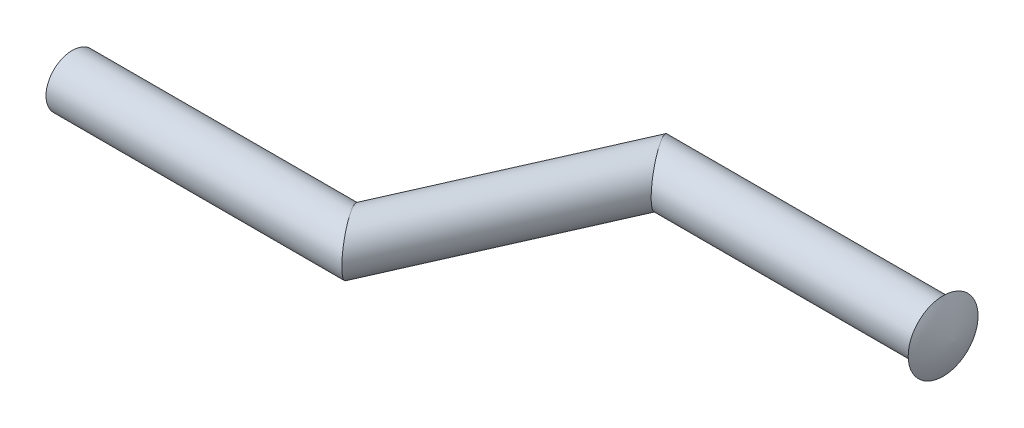
ISO-10303-21;
HEADER;
FILE_DESCRIPTION(('STEP AP214'),'2;1');
FILE_NAME('part.step','',(''),(''),'','','');
FILE_SCHEMA(('AUTOMOTIVE_DESIGN { 1 0 10303 214 1 1 1 1 }'));
ENDSEC;
DATA;
#1=APPLICATION_CONTEXT('core data for automotive mechanical design processes');
#2=APPLICATION_PROTOCOL_DEFINITION('international standard','automotive_design',2000,#1);
#3=PRODUCT_CONTEXT('',#1,'mechanical');
#4=PRODUCT('Part','Part','',(#3));
#5=PRODUCT_RELATED_PRODUCT_CATEGORY('part','',(#4));
#6=PRODUCT_DEFINITION_FORMATION('','',#4);
#7=PRODUCT_DEFINITION_CONTEXT('part definition',#1,'design');
#8=PRODUCT_DEFINITION('design','',#6,#7);
#9=PRODUCT_DEFINITION_SHAPE('','',#8);
#10=(LENGTH_UNIT() NAMED_UNIT(*) SI_UNIT(.MILLI.,.METRE.));
#11=(NAMED_UNIT(*) PLANE_ANGLE_UNIT() SI_UNIT($,.RADIAN.));
#12=(NAMED_UNIT(*) SI_UNIT($,.STERADIAN.) SOLID_ANGLE_UNIT());
#13=UNCERTAINTY_MEASURE_WITH_UNIT(LENGTH_MEASURE(1.E-05),#10,'distance_accuracy_value','');
#14=(GEOMETRIC_REPRESENTATION_CONTEXT(3) GLOBAL_UNCERTAINTY_ASSIGNED_CONTEXT((#13)) GLOBAL_UNIT_ASSIGNED_CONTEXT((#10,
#11,#12)) REPRESENTATION_CONTEXT('',''));
#15=CARTESIAN_POINT('',(0.,0.,0.));
#16=DIRECTION('',(0.,0.,1.));
#17=DIRECTION('',(1.,0.,0.));
#18=AXIS2_PLACEMENT_3D('',#15,#16,#17);
#19=CARTESIAN_POINT('',(-222.882267398916,0.,72.7461736455126));
#20=DIRECTION('',(1.,0.,0.));
#21=DIRECTION('',(0.,0.,-1.));
#22=AXIS2_PLACEMENT_3D('',#19,#20,#21);
#23=PLANE('',#22);
#24=CARTESIAN_POINT('',(-222.882267398916,0.,72.7461736455126));
#25=DIRECTION('',(1.,0.,0.));
#26=DIRECTION('',(0.,0.,-1.));
#27=AXIS2_PLACEMENT_3D('',#24,#25,#26);
#28=CIRCLE('',#27,8.89);
#29=CARTESIAN_POINT('',(-222.882267398916,0.,63.8561736455126));
#30=VERTEX_POINT('',#29);
#31=EDGE_CURVE('E37',#30,#30,#28,.T.);
#32=ORIENTED_EDGE('',*,*,#31,.F.);
#33=EDGE_LOOP('',(#32));
#34=FACE_BOUND('',#33,.T.);
#35=ADVANCED_FACE('F34',(#34),#23,.F.);
#36=CARTESIAN_POINT('',(-121.792394354703,0.,72.7461736455126));
#37=DIRECTION('',(-1.,0.,0.));
#38=DIRECTION('',(0.,0.,1.));
#39=AXIS2_PLACEMENT_3D('',#36,#37,#38);
#40=CYLINDRICAL_SURFACE('',#39,8.89);
#41=CARTESIAN_POINT('',(-128.252610357535,0.,72.7461736455126));
#42=DIRECTION('',(-0.838292149650602,0.,0.545221305374408));
#43=DIRECTION('',(0.545221305374408,0.,0.838292149650602));
#44=AXIS2_PLACEMENT_3D('',#41,#42,#43);
#45=ELLIPSE('',#44,10.6048947299642,8.89);
#46=CARTESIAN_POINT('',(-122.470595809506,0.,81.6361736455126));
#47=VERTEX_POINT('',#46);
#48=EDGE_CURVE('E78',#47,#47,#45,.T.);
#49=ORIENTED_EDGE('',*,*,#48,.T.);
#50=EDGE_LOOP('',(#49));
#51=FACE_BOUND('',#50,.T.);
#52=ORIENTED_EDGE('',*,*,#31,.T.);
#53=EDGE_LOOP('',(#52));
#54=FACE_BOUND('',#53,.T.);
#55=ADVANCED_FACE('F64',(#51,#54),#40,.T.);
#56=CARTESIAN_POINT('',(-93.3655079188289,0.,-5.90534469255629));
#57=DIRECTION('',(-0.405467456331653,0.,0.914109480235239));
#58=DIRECTION('',(0.914109480235239,0.,0.405467456331653));
#59=AXIS2_PLACEMENT_3D('',#56,#57,#58);
#60=CYLINDRICAL_SURFACE('',#59,8.89);
#61=CARTESIAN_POINT('',(-95.9849152688503,0.,0.));
#62=DIRECTION('',(-0.838292149650602,0.,0.545221305374408));
#63=DIRECTION('',(-0.545221305374408,0.,-0.838292149650602));
#64=AXIS2_PLACEMENT_3D('',#61,#62,#63);
#65=ELLIPSE('',#64,10.6048947299642,8.89);
#66=CARTESIAN_POINT('',(-101.76692981688,0.,-8.89));
#67=VERTEX_POINT('',#66);
#68=EDGE_CURVE('E11',#67,#67,#65,.T.);
#69=ORIENTED_EDGE('',*,*,#68,.T.);
#70=EDGE_LOOP('',(#69));
#71=FACE_BOUND('',#70,.T.);
#72=ORIENTED_EDGE('',*,*,#48,.F.);
#73=EDGE_LOOP('',(#72));
#74=FACE_BOUND('',#73,.T.);
#75=ADVANCED_FACE('F58',(#71,#74),#60,.T.);
#76=CARTESIAN_POINT('',(0.,0.,0.));
#77=DIRECTION('',(-1.,0.,0.));
#78=DIRECTION('',(0.,0.,1.));
#79=AXIS2_PLACEMENT_3D('',#76,#77,#78);
#80=CYLINDRICAL_SURFACE('',#79,8.89);
#81=CARTESIAN_POINT('',(0.,0.,0.));
#82=DIRECTION('',(1.,0.,0.));
#83=DIRECTION('',(0.,0.,-1.));
#84=AXIS2_PLACEMENT_3D('',#81,#82,#83);
#85=CIRCLE('',#84,8.89);
#86=CARTESIAN_POINT('',(0.,0.,-8.89));
#87=VERTEX_POINT('',#86);
#88=EDGE_CURVE('E41',#87,#87,#85,.T.);
#89=ORIENTED_EDGE('',*,*,#88,.F.);
#90=EDGE_LOOP('',(#89));
#91=FACE_BOUND('',#90,.T.);
#92=ORIENTED_EDGE('',*,*,#68,.F.);
#93=EDGE_LOOP('',(#92));
#94=FACE_BOUND('',#93,.T.);
#95=ADVANCED_FACE('F53',(#91,#94),#80,.T.);
#96=CARTESIAN_POINT('',(0.,0.,0.));
#97=DIRECTION('',(1.,0.,0.));
#98=DIRECTION('',(0.,0.,-1.));
#99=AXIS2_PLACEMENT_3D('',#96,#97,#98);
#100=PLANE('',#99);
#101=ORIENTED_EDGE('',*,*,#88,.T.);
#102=EDGE_LOOP('',(#101));
#103=FACE_BOUND('',#102,.T.);
#104=CARTESIAN_POINT('',(0.,0.,0.));
#105=DIRECTION('',(-1.,0.,0.));
#106=DIRECTION('',(0.,0.,1.));
#107=AXIS2_PLACEMENT_3D('',#104,#105,#106);
#108=CIRCLE('',#107,11.8604605662378);
#109=CARTESIAN_POINT('',(0.,0.,11.8604605662378));
#110=VERTEX_POINT('',#109);
#111=EDGE_CURVE('E81',#110,#110,#108,.T.);
#112=ORIENTED_EDGE('',*,*,#111,.T.);
#113=EDGE_LOOP('',(#112));
#114=FACE_BOUND('',#113,.T.);
#115=ADVANCED_FACE('F47',(#103,#114),#100,.F.);
#116=CARTESIAN_POINT('',(-27.0940917383905,0.,-2.34195249865787));
#117=DIRECTION('',(0.,-1.,0.));
#118=DIRECTION('',(0.,0.,1.));
#119=AXIS2_PLACEMENT_3D('',#116,#117,#118);
#120=CIRCLE('',#119,30.5908212376562);
#121=TRIMMED_CURVE('',#120,(PARAMETER_VALUE(-1.49416398521679)),
(PARAMETER_VALUE(1.49416398521679)),.T.,.PARAMETER.);
#122=CARTESIAN_POINT('',(-27.0940917383905,0.,0.));
#123=DIRECTION('',(-1.,0.,0.));
#124=AXIS1_PLACEMENT('',#122,#123);
#125=SURFACE_OF_REVOLUTION('',#121,#124);
#126=ORIENTED_EDGE('',*,*,#111,.F.);
#127=EDGE_LOOP('',(#126));
#128=FACE_BOUND('',#127,.T.);
#129=CARTESIAN_POINT('',(3.40695090753014,0.,0.));
#130=VERTEX_POINT('',#129);
#131=VERTEX_LOOP('',#130);
#132=FACE_BOUND('',#131,.T.);
#133=ADVANCED_FACE('F45',(#128,#132),#125,.T.);
#134=CLOSED_SHELL('',(#35,#55,#75,#95,#115,#133));
#135=MANIFOLD_SOLID_BREP('B2',#134);
#136=ADVANCED_BREP_SHAPE_REPRESENTATION('',(#18,#135),#14);
#137=SHAPE_DEFINITION_REPRESENTATION(#9,#136);
ENDSEC;
END-ISO-10303-21;
